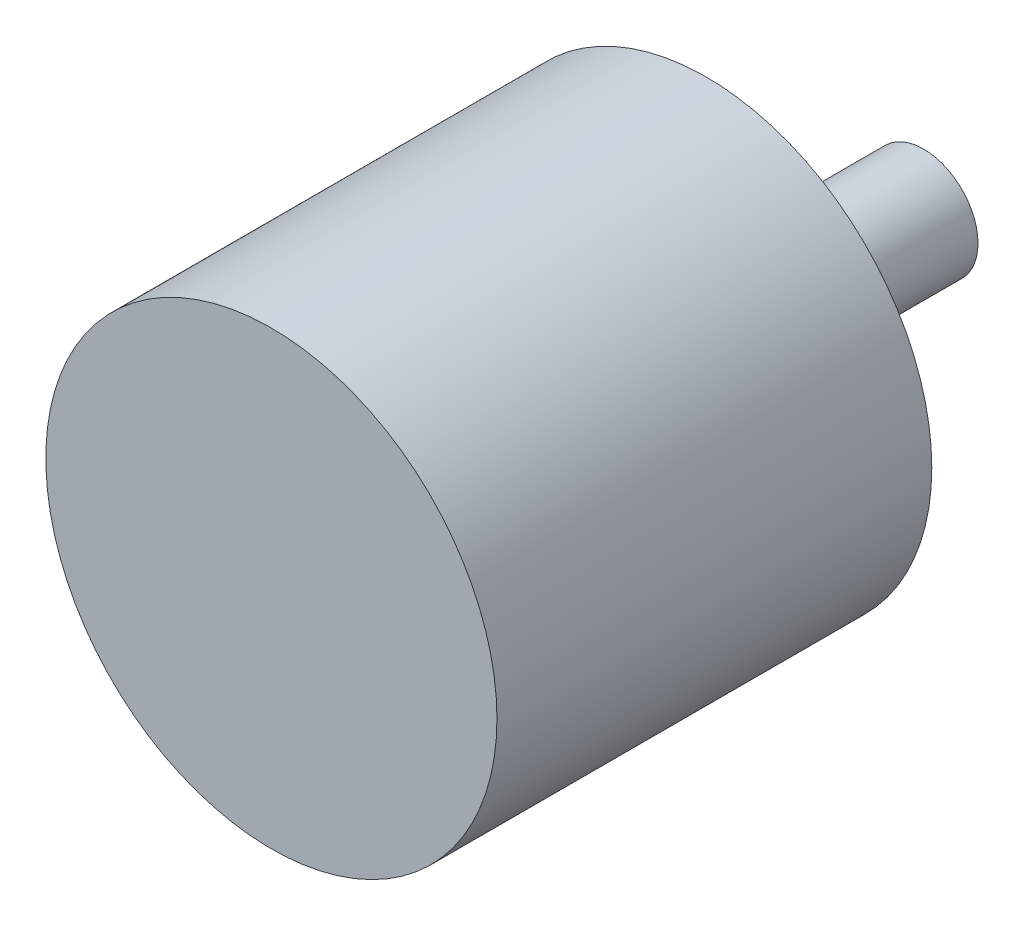
ISO-10303-21;
HEADER;
FILE_DESCRIPTION(('STEP AP214'),'2;1');
FILE_NAME('part.step','',(''),(''),'','','');
FILE_SCHEMA(('AUTOMOTIVE_DESIGN { 1 0 10303 214 1 1 1 1 }'));
ENDSEC;
DATA;
#1=APPLICATION_CONTEXT('core data for automotive mechanical design processes');
#2=APPLICATION_PROTOCOL_DEFINITION('international standard','automotive_design',2000,#1);
#3=PRODUCT_CONTEXT('',#1,'mechanical');
#4=PRODUCT('Part','Part','',(#3));
#5=PRODUCT_RELATED_PRODUCT_CATEGORY('part','',(#4));
#6=PRODUCT_DEFINITION_FORMATION('','',#4);
#7=PRODUCT_DEFINITION_CONTEXT('part definition',#1,'design');
#8=PRODUCT_DEFINITION('design','',#6,#7);
#9=PRODUCT_DEFINITION_SHAPE('','',#8);
#10=(LENGTH_UNIT() NAMED_UNIT(*) SI_UNIT(.MILLI.,.METRE.));
#11=(NAMED_UNIT(*) PLANE_ANGLE_UNIT() SI_UNIT($,.RADIAN.));
#12=(NAMED_UNIT(*) SI_UNIT($,.STERADIAN.) SOLID_ANGLE_UNIT());
#13=UNCERTAINTY_MEASURE_WITH_UNIT(LENGTH_MEASURE(1.E-05),#10,'distance_accuracy_value','');
#14=(GEOMETRIC_REPRESENTATION_CONTEXT(3) GLOBAL_UNCERTAINTY_ASSIGNED_CONTEXT((#13)) GLOBAL_UNIT_ASSIGNED_CONTEXT((#10,
#11,#12)) REPRESENTATION_CONTEXT('',''));
#15=CARTESIAN_POINT('',(0.,0.,0.));
#16=DIRECTION('',(0.,0.,1.));
#17=DIRECTION('',(1.,0.,0.));
#18=AXIS2_PLACEMENT_3D('',#15,#16,#17);
#19=CARTESIAN_POINT('',(0.,0.,2.));
#20=DIRECTION('',(0.,0.,-1.));
#21=DIRECTION('',(-1.,0.,0.));
#22=AXIS2_PLACEMENT_3D('',#19,#20,#21);
#23=CYLINDRICAL_SURFACE('',#22,0.5);
#24=CARTESIAN_POINT('',(0.,0.,2.));
#25=DIRECTION('',(0.,0.,1.));
#26=DIRECTION('',(1.,0.,0.));
#27=AXIS2_PLACEMENT_3D('',#24,#25,#26);
#28=CIRCLE('',#27,0.5);
#29=CARTESIAN_POINT('',(0.5,0.,2.));
#30=VERTEX_POINT('',#29);
#31=EDGE_CURVE('E10',#30,#30,#28,.T.);
#32=ORIENTED_EDGE('',*,*,#31,.F.);
#33=EDGE_LOOP('',(#32));
#34=FACE_BOUND('',#33,.T.);
#35=CARTESIAN_POINT('',(0.,0.,0.));
#36=DIRECTION('',(0.,0.,1.));
#37=DIRECTION('',(1.,0.,0.));
#38=AXIS2_PLACEMENT_3D('',#35,#36,#37);
#39=CIRCLE('',#38,0.5);
#40=CARTESIAN_POINT('',(0.5,0.,0.));
#41=VERTEX_POINT('',#40);
#42=EDGE_CURVE('E40',#41,#41,#39,.T.);
#43=ORIENTED_EDGE('',*,*,#42,.T.);
#44=EDGE_LOOP('',(#43));
#45=FACE_BOUND('',#44,.T.);
#46=ADVANCED_FACE('F37',(#34,#45),#23,.T.);
#47=CARTESIAN_POINT('',(0.,0.,0.));
#48=DIRECTION('',(0.,0.,1.));
#49=DIRECTION('',(1.,0.,0.));
#50=AXIS2_PLACEMENT_3D('',#47,#48,#49);
#51=PLANE('',#50);
#52=ORIENTED_EDGE('',*,*,#42,.F.);
#53=EDGE_LOOP('',(#52));
#54=FACE_BOUND('',#53,.T.);
#55=ADVANCED_FACE('F60',(#54),#51,.F.);
#56=CARTESIAN_POINT('',(0.,0.,6.));
#57=DIRECTION('',(0.,0.,-1.));
#58=DIRECTION('',(-1.,0.,0.));
#59=AXIS2_PLACEMENT_3D('',#56,#57,#58);
#60=CYLINDRICAL_SURFACE('',#59,2.075);
#61=CARTESIAN_POINT('',(0.,0.,6.));
#62=DIRECTION('',(0.,0.,1.));
#63=DIRECTION('',(1.,0.,0.));
#64=AXIS2_PLACEMENT_3D('',#61,#62,#63);
#65=CIRCLE('',#64,2.075);
#66=CARTESIAN_POINT('',(2.075,0.,6.));
#67=VERTEX_POINT('',#66);
#68=EDGE_CURVE('E47',#67,#67,#65,.T.);
#69=ORIENTED_EDGE('',*,*,#68,.F.);
#70=EDGE_LOOP('',(#69));
#71=FACE_BOUND('',#70,.T.);
#72=CARTESIAN_POINT('',(0.,0.,2.));
#73=DIRECTION('',(0.,0.,1.));
#74=DIRECTION('',(1.,0.,0.));
#75=AXIS2_PLACEMENT_3D('',#72,#73,#74);
#76=CIRCLE('',#75,2.075);
#77=CARTESIAN_POINT('',(2.075,0.,2.));
#78=VERTEX_POINT('',#77);
#79=EDGE_CURVE('E49',#78,#78,#76,.T.);
#80=ORIENTED_EDGE('',*,*,#79,.T.);
#81=EDGE_LOOP('',(#80));
#82=FACE_BOUND('',#81,.T.);
#83=ADVANCED_FACE('F57',(#71,#82),#60,.T.);
#84=CARTESIAN_POINT('',(0.,0.,6.));
#85=DIRECTION('',(0.,0.,1.));
#86=DIRECTION('',(1.,0.,0.));
#87=AXIS2_PLACEMENT_3D('',#84,#85,#86);
#88=PLANE('',#87);
#89=ORIENTED_EDGE('',*,*,#68,.T.);
#90=EDGE_LOOP('',(#89));
#91=FACE_BOUND('',#90,.T.);
#92=ADVANCED_FACE('F55',(#91),#88,.T.);
#93=CARTESIAN_POINT('',(0.,0.,2.));
#94=DIRECTION('',(0.,0.,1.));
#95=DIRECTION('',(1.,0.,0.));
#96=AXIS2_PLACEMENT_3D('',#93,#94,#95);
#97=PLANE('',#96);
#98=ORIENTED_EDGE('',*,*,#31,.T.);
#99=EDGE_LOOP('',(#98));
#100=FACE_BOUND('',#99,.T.);
#101=ORIENTED_EDGE('',*,*,#79,.F.);
#102=EDGE_LOOP('',(#101));
#103=FACE_BOUND('',#102,.T.);
#104=ADVANCED_FACE('F64',(#100,#103),#97,.F.);
#105=CLOSED_SHELL('',(#46,#55,#83,#92,#104));
#106=MANIFOLD_SOLID_BREP('B2',#105);
#107=ADVANCED_BREP_SHAPE_REPRESENTATION('',(#18,#106),#14);
#108=SHAPE_DEFINITION_REPRESENTATION(#9,#107);
ENDSEC;
END-ISO-10303-21;
